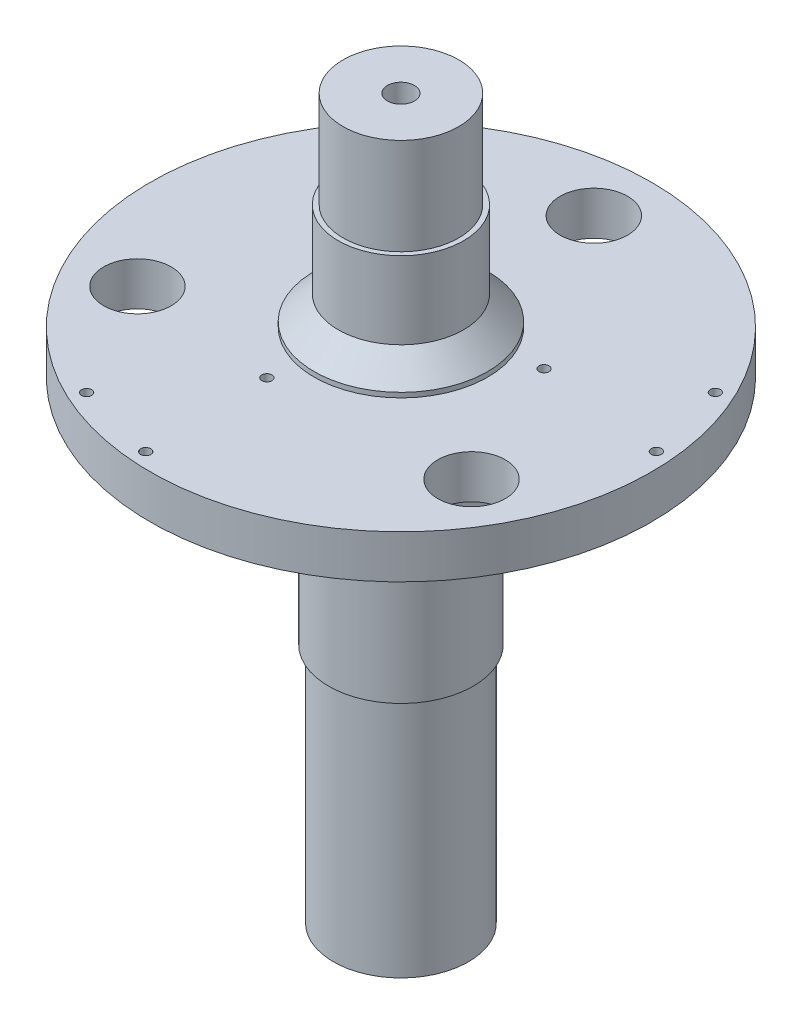
ISO-10303-21;
HEADER;
FILE_DESCRIPTION(('STEP AP214'),'2;1');
FILE_NAME('part.step','',(''),(''),'','','');
FILE_SCHEMA(('AUTOMOTIVE_DESIGN { 1 0 10303 214 1 1 1 1 }'));
ENDSEC;
DATA;
#1=APPLICATION_CONTEXT('core data for automotive mechanical design processes');
#2=APPLICATION_PROTOCOL_DEFINITION('international standard','automotive_design',2000,#1);
#3=PRODUCT_CONTEXT('',#1,'mechanical');
#4=PRODUCT('Part','Part','',(#3));
#5=PRODUCT_RELATED_PRODUCT_CATEGORY('part','',(#4));
#6=PRODUCT_DEFINITION_FORMATION('','',#4);
#7=PRODUCT_DEFINITION_CONTEXT('part definition',#1,'design');
#8=PRODUCT_DEFINITION('design','',#6,#7);
#9=PRODUCT_DEFINITION_SHAPE('','',#8);
#10=(LENGTH_UNIT() NAMED_UNIT(*) SI_UNIT(.MILLI.,.METRE.));
#11=(NAMED_UNIT(*) PLANE_ANGLE_UNIT() SI_UNIT($,.RADIAN.));
#12=(NAMED_UNIT(*) SI_UNIT($,.STERADIAN.) SOLID_ANGLE_UNIT());
#13=UNCERTAINTY_MEASURE_WITH_UNIT(LENGTH_MEASURE(1.E-05),#10,'distance_accuracy_value','');
#14=(GEOMETRIC_REPRESENTATION_CONTEXT(3) GLOBAL_UNCERTAINTY_ASSIGNED_CONTEXT((#13)) GLOBAL_UNIT_ASSIGNED_CONTEXT((#10,
#11,#12)) REPRESENTATION_CONTEXT('',''));
#15=CARTESIAN_POINT('',(0.,0.,0.));
#16=DIRECTION('',(0.,0.,1.));
#17=DIRECTION('',(1.,0.,0.));
#18=AXIS2_PLACEMENT_3D('',#15,#16,#17);
#19=CARTESIAN_POINT('',(0.,0.,0.));
#20=DIRECTION('',(0.,-1.,0.));
#21=DIRECTION('',(0.,0.,-1.));
#22=AXIS2_PLACEMENT_3D('',#19,#20,#21);
#23=PLANE('',#22);
#24=CARTESIAN_POINT('',(0.,0.,0.));
#25=DIRECTION('',(0.,1.,0.));
#26=DIRECTION('',(0.,0.,1.));
#27=AXIS2_PLACEMENT_3D('',#24,#25,#26);
#28=CIRCLE('',#27,14.);
#29=CARTESIAN_POINT('',(0.,0.,14.));
#30=VERTEX_POINT('',#29);
#31=EDGE_CURVE('E63',#30,#30,#28,.T.);
#32=ORIENTED_EDGE('',*,*,#31,.F.);
#33=EDGE_LOOP('',(#32));
#34=FACE_BOUND('',#33,.T.);
#35=CARTESIAN_POINT('',(0.,0.,0.));
#36=DIRECTION('',(0.,-1.,0.));
#37=DIRECTION('',(0.,0.,-1.));
#38=AXIS2_PLACEMENT_3D('',#35,#36,#37);
#39=CIRCLE('',#38,60.);
#40=CARTESIAN_POINT('',(0.,0.,-60.));
#41=VERTEX_POINT('',#40);
#42=EDGE_CURVE('E11',#41,#41,#39,.T.);
#43=ORIENTED_EDGE('',*,*,#42,.F.);
#44=EDGE_LOOP('',(#43));
#45=FACE_BOUND('',#44,.T.);
#46=ADVANCED_FACE('F43',(#34,#45),#23,.F.);
#47=CARTESIAN_POINT('',(0.,-745.,0.));
#48=DIRECTION('',(0.,-1.,0.));
#49=DIRECTION('',(0.,0.,-1.));
#50=AXIS2_PLACEMENT_3D('',#47,#48,#49);
#51=CYLINDRICAL_SURFACE('',#50,60.);
#52=CARTESIAN_POINT('',(0.,-100.,0.));
#53=DIRECTION('',(0.,-1.,0.));
#54=DIRECTION('',(0.,0.,-1.));
#55=AXIS2_PLACEMENT_3D('',#52,#53,#54);
#56=CIRCLE('',#55,60.);
#57=CARTESIAN_POINT('',(0.,-100.,-60.));
#58=VERTEX_POINT('',#57);
#59=EDGE_CURVE('E49',#58,#58,#56,.T.);
#60=ORIENTED_EDGE('',*,*,#59,.F.);
#61=EDGE_LOOP('',(#60));
#62=FACE_BOUND('',#61,.T.);
#63=ORIENTED_EDGE('',*,*,#42,.T.);
#64=EDGE_LOOP('',(#63));
#65=FACE_BOUND('',#64,.T.);
#66=ADVANCED_FACE('F103',(#62,#65),#51,.T.);
#67=CARTESIAN_POINT('',(-60.,-100.,0.));
#68=DIRECTION('',(0.,-1.,0.));
#69=DIRECTION('',(0.,0.,-1.));
#70=AXIS2_PLACEMENT_3D('',#67,#68,#69);
#71=PLANE('',#70);
#72=CARTESIAN_POINT('',(0.,-100.,0.));
#73=DIRECTION('',(0.,-1.,0.));
#74=DIRECTION('',(0.,0.,-1.));
#75=AXIS2_PLACEMENT_3D('',#72,#73,#74);
#76=CIRCLE('',#75,65.);
#77=CARTESIAN_POINT('',(0.,-100.,-65.));
#78=VERTEX_POINT('',#77);
#79=EDGE_CURVE('E96',#78,#78,#76,.T.);
#80=ORIENTED_EDGE('',*,*,#79,.F.);
#81=EDGE_LOOP('',(#80));
#82=FACE_BOUND('',#81,.T.);
#83=ORIENTED_EDGE('',*,*,#59,.T.);
#84=EDGE_LOOP('',(#83));
#85=FACE_BOUND('',#84,.T.);
#86=ADVANCED_FACE('F101',(#82,#85),#71,.F.);
#87=CARTESIAN_POINT('',(0.,-745.,0.));
#88=DIRECTION('',(0.,-1.,0.));
#89=DIRECTION('',(0.,0.,-1.));
#90=AXIS2_PLACEMENT_3D('',#87,#88,#89);
#91=CYLINDRICAL_SURFACE('',#90,65.0000000000001);
#92=CARTESIAN_POINT('',(0.,-180.,0.));
#93=DIRECTION('',(0.,-1.,0.));
#94=DIRECTION('',(0.,0.,-1.));
#95=AXIS2_PLACEMENT_3D('',#92,#93,#94);
#96=CIRCLE('',#95,65.0000000000001);
#97=CARTESIAN_POINT('',(0.,-180.,-65.0000000000001));
#98=VERTEX_POINT('',#97);
#99=EDGE_CURVE('E93',#98,#98,#96,.T.);
#100=ORIENTED_EDGE('',*,*,#99,.F.);
#101=EDGE_LOOP('',(#100));
#102=FACE_BOUND('',#101,.T.);
#103=ORIENTED_EDGE('',*,*,#79,.T.);
#104=EDGE_LOOP('',(#103));
#105=FACE_BOUND('',#104,.T.);
#106=ADVANCED_FACE('F161',(#102,#105),#91,.T.);
#107=CARTESIAN_POINT('',(0.,-180.,0.));
#108=DIRECTION('',(0.,-1.,0.));
#109=DIRECTION('',(0.,0.,-1.));
#110=AXIS2_PLACEMENT_3D('',#107,#108,#109);
#111=CONICAL_SURFACE('',#110,65.0000000000001,0.78539816339745);
#112=CARTESIAN_POINT('',(0.,-205.,0.));
#113=DIRECTION('',(0.,-1.,0.));
#114=DIRECTION('',(0.,0.,-1.));
#115=AXIS2_PLACEMENT_3D('',#112,#113,#114);
#116=CIRCLE('',#115,90.);
#117=CARTESIAN_POINT('',(0.,-205.,-90.));
#118=VERTEX_POINT('',#117);
#119=EDGE_CURVE('E90',#118,#118,#116,.T.);
#120=ORIENTED_EDGE('',*,*,#119,.F.);
#121=EDGE_LOOP('',(#120));
#122=FACE_BOUND('',#121,.T.);
#123=ORIENTED_EDGE('',*,*,#99,.T.);
#124=EDGE_LOOP('',(#123));
#125=FACE_BOUND('',#124,.T.);
#126=ADVANCED_FACE('F157',(#122,#125),#111,.T.);
#127=CARTESIAN_POINT('',(0.,-745.,0.));
#128=DIRECTION('',(0.,-1.,0.));
#129=DIRECTION('',(0.,0.,-1.));
#130=AXIS2_PLACEMENT_3D('',#127,#128,#129);
#131=CYLINDRICAL_SURFACE('',#130,90.);
#132=CARTESIAN_POINT('',(0.,-210.,0.));
#133=DIRECTION('',(0.,-1.,0.));
#134=DIRECTION('',(0.,0.,-1.));
#135=AXIS2_PLACEMENT_3D('',#132,#133,#134);
#136=CIRCLE('',#135,90.);
#137=CARTESIAN_POINT('',(0.,-210.,-90.));
#138=VERTEX_POINT('',#137);
#139=EDGE_CURVE('E87',#138,#138,#136,.T.);
#140=ORIENTED_EDGE('',*,*,#139,.F.);
#141=EDGE_LOOP('',(#140));
#142=FACE_BOUND('',#141,.T.);
#143=ORIENTED_EDGE('',*,*,#119,.T.);
#144=EDGE_LOOP('',(#143));
#145=FACE_BOUND('',#144,.T.);
#146=ADVANCED_FACE('F153',(#142,#145),#131,.T.);
#147=CARTESIAN_POINT('',(-90.,-210.,0.));
#148=DIRECTION('',(0.,-1.,0.));
#149=DIRECTION('',(0.,0.,-1.));
#150=AXIS2_PLACEMENT_3D('',#147,#148,#149);
#151=PLANE('',#150);
#152=CARTESIAN_POINT('',(-140.014777196767,-210.,-201.049402303364));
#153=DIRECTION('',(0.,1.,0.));
#154=DIRECTION('',(-0.866025403784436,0.,-0.500000000000004));
#155=AXIS2_PLACEMENT_3D('',#152,#153,#154);
#156=CIRCLE('',#155,5.25);
#157=CARTESIAN_POINT('',(-144.561410566635,-210.,-203.674402303364));
#158=VERTEX_POINT('',#157);
#159=EDGE_CURVE('E439',#158,#158,#156,.T.);
#160=ORIENTED_EDGE('',*,*,#159,.F.);
#161=EDGE_LOOP('',(#160));
#162=FACE_BOUND('',#161,.T.);
#163=CARTESIAN_POINT('',(-201.202562281703,-210.,-139.794595500961));
#164=DIRECTION('',(0.,1.,0.));
#165=DIRECTION('',(-0.866025403784436,0.,-0.500000000000004));
#166=AXIS2_PLACEMENT_3D('',#163,#164,#165);
#167=CIRCLE('',#166,5.25);
#168=CARTESIAN_POINT('',(-205.749195651571,-210.,-142.419595500961));
#169=VERTEX_POINT('',#168);
#170=EDGE_CURVE('E453',#169,#169,#167,.T.);
#171=ORIENTED_EDGE('',*,*,#170,.F.);
#172=EDGE_LOOP('',(#171));
#173=FACE_BOUND('',#172,.T.);
#174=CARTESIAN_POINT('',(111.599940600251,-210.,-36.7655172413023));
#175=DIRECTION('',(0.,1.,0.));
#176=DIRECTION('',(0.866025403784443,0.,-0.499999999999992));
#177=AXIS2_PLACEMENT_3D('',#174,#175,#176);
#178=CIRCLE('',#177,5.25);
#179=CARTESIAN_POINT('',(116.146573970119,-210.,-39.3905172413023));
#180=VERTEX_POINT('',#179);
#181=EDGE_CURVE('E459',#180,#180,#178,.T.);
#182=ORIENTED_EDGE('',*,*,#181,.F.);
#183=EDGE_LOOP('',(#182));
#184=FACE_BOUND('',#183,.T.);
#185=CARTESIAN_POINT('',(244.121278408774,-210.,-20.731652805935));
#186=DIRECTION('',(0.,1.,0.));
#187=DIRECTION('',(0.866025403784443,0.,-0.499999999999992));
#188=AXIS2_PLACEMENT_3D('',#185,#186,#187);
#189=CIRCLE('',#188,5.25);
#190=CARTESIAN_POINT('',(248.667911778642,-210.,-23.356652805935));
#191=VERTEX_POINT('',#190);
#192=EDGE_CURVE('E465',#191,#191,#189,.T.);
#193=ORIENTED_EDGE('',*,*,#192,.F.);
#194=EDGE_LOOP('',(#193));
#195=FACE_BOUND('',#194,.T.);
#196=CARTESIAN_POINT('',(221.666952156454,-210.,-104.349232491994));
#197=DIRECTION('',(0.,1.,0.));
#198=DIRECTION('',(0.866025403784443,0.,-0.499999999999992));
#199=AXIS2_PLACEMENT_3D('',#196,#197,#198);
#200=CIRCLE('',#199,5.25);
#201=CARTESIAN_POINT('',(226.213585526323,-210.,-106.974232491994));
#202=VERTEX_POINT('',#201);
#203=EDGE_CURVE('E448',#202,#202,#200,.T.);
#204=ORIENTED_EDGE('',*,*,#203,.F.);
#205=EDGE_LOOP('',(#204));
#206=FACE_BOUND('',#205,.T.);
#207=CARTESIAN_POINT('',(-87.6398422143684,-210.,-78.265625));
#208=DIRECTION('',(0.,1.,0.));
#209=DIRECTION('',(-0.866025403784436,0.,-0.500000000000004));
#210=AXIS2_PLACEMENT_3D('',#207,#208,#209);
#211=CIRCLE('',#210,5.25);
#212=CARTESIAN_POINT('',(-92.1864755842366,-210.,-80.890625));
#213=VERTEX_POINT('',#212);
#214=EDGE_CURVE('E438',#213,#213,#211,.T.);
#215=ORIENTED_EDGE('',*,*,#214,.F.);
#216=EDGE_LOOP('',(#215));
#217=FACE_BOUND('',#216,.T.);
#218=CARTESIAN_POINT('',(-23.9600983858817,-210.,115.031142241303));
#219=DIRECTION('',(0.,1.,0.));
#220=DIRECTION('',(0.,0.,1.));
#221=AXIS2_PLACEMENT_3D('',#218,#219,#220);
#222=CIRCLE('',#221,5.25);
#223=CARTESIAN_POINT('',(-23.9600983858817,-210.,120.281142241303));
#224=VERTEX_POINT('',#223);
#225=EDGE_CURVE('E476',#224,#224,#222,.T.);
#226=ORIENTED_EDGE('',*,*,#225,.F.);
#227=EDGE_LOOP('',(#226));
#228=FACE_BOUND('',#227,.T.);
#229=CARTESIAN_POINT('',(-104.106501212006,-210.,221.7810551093));
#230=DIRECTION('',(0.,1.,0.));
#231=DIRECTION('',(0.,0.,1.));
#232=AXIS2_PLACEMENT_3D('',#229,#230,#231);
#233=CIRCLE('',#232,5.25);
#234=CARTESIAN_POINT('',(-104.106501212006,-210.,227.0310551093));
#235=VERTEX_POINT('',#234);
#236=EDGE_CURVE('E482',#235,#235,#233,.T.);
#237=ORIENTED_EDGE('',*,*,#236,.F.);
#238=EDGE_LOOP('',(#237));
#239=FACE_BOUND('',#238,.T.);
#240=CARTESIAN_POINT('',(-20.4643898747497,-210.,244.143827992956));
#241=DIRECTION('',(0.,1.,0.));
#242=DIRECTION('',(0.,0.,1.));
#243=AXIS2_PLACEMENT_3D('',#240,#241,#242);
#244=CIRCLE('',#243,5.25);
#245=CARTESIAN_POINT('',(-20.4643898747497,-210.,249.393827992956));
#246=VERTEX_POINT('',#245);
#247=EDGE_CURVE('E470',#246,#246,#244,.T.);
#248=ORIENTED_EDGE('',*,*,#247,.F.);
#249=EDGE_LOOP('',(#248));
#250=FACE_BOUND('',#249,.T.);
#251=CARTESIAN_POINT('',(0.,-210.,-200.));
#252=DIRECTION('',(0.,1.,0.));
#253=DIRECTION('',(-0.866025403784436,0.,-0.500000000000004));
#254=AXIS2_PLACEMENT_3D('',#251,#252,#253);
#255=CIRCLE('',#254,35.);
#256=CARTESIAN_POINT('',(-30.3108891324554,-210.,-217.5));
#257=VERTEX_POINT('',#256);
#258=EDGE_CURVE('E490',#257,#257,#255,.T.);
#259=ORIENTED_EDGE('',*,*,#258,.F.);
#260=EDGE_LOOP('',(#259));
#261=FACE_BOUND('',#260,.T.);
#262=CARTESIAN_POINT('',(173.205080756887,-210.,100.000000000001));
#263=DIRECTION('',(0.,1.,0.));
#264=DIRECTION('',(0.866025403784443,0.,-0.499999999999992));
#265=AXIS2_PLACEMENT_3D('',#262,#263,#264);
#266=CIRCLE('',#265,35.);
#267=CARTESIAN_POINT('',(203.515969889343,-210.,82.500000000001));
#268=VERTEX_POINT('',#267);
#269=EDGE_CURVE('E475',#268,#268,#266,.T.);
#270=ORIENTED_EDGE('',*,*,#269,.F.);
#271=EDGE_LOOP('',(#270));
#272=FACE_BOUND('',#271,.T.);
#273=CARTESIAN_POINT('',(-173.205080756887,-210.,100.000000000001));
#274=DIRECTION('',(0.,1.,0.));
#275=DIRECTION('',(0.,0.,1.));
#276=AXIS2_PLACEMENT_3D('',#273,#274,#275);
#277=CIRCLE('',#276,35.);
#278=CARTESIAN_POINT('',(-173.205080756887,-210.,135.000000000001));
#279=VERTEX_POINT('',#278);
#280=EDGE_CURVE('E497',#279,#279,#277,.T.);
#281=ORIENTED_EDGE('',*,*,#280,.F.);
#282=EDGE_LOOP('',(#281));
#283=FACE_BOUND('',#282,.T.);
#284=CARTESIAN_POINT('',(0.,-210.,0.));
#285=DIRECTION('',(0.,-1.,0.));
#286=DIRECTION('',(0.,0.,-1.));
#287=AXIS2_PLACEMENT_3D('',#284,#285,#286);
#288=CIRCLE('',#287,260.);
#289=CARTESIAN_POINT('',(0.,-210.,-260.));
#290=VERTEX_POINT('',#289);
#291=EDGE_CURVE('E84',#290,#290,#288,.T.);
#292=ORIENTED_EDGE('',*,*,#291,.F.);
#293=EDGE_LOOP('',(#292));
#294=FACE_BOUND('',#293,.T.);
#295=ORIENTED_EDGE('',*,*,#139,.T.);
#296=EDGE_LOOP('',(#295));
#297=FACE_BOUND('',#296,.T.);
#298=ADVANCED_FACE('F149',(#162,#173,#184,#195,#206,#217,#228,#239,#250,#261,#272,#283,#294,
#297),#151,.F.);
#299=CARTESIAN_POINT('',(0.,-745.,0.));
#300=DIRECTION('',(0.,-1.,0.));
#301=DIRECTION('',(0.,0.,-1.));
#302=AXIS2_PLACEMENT_3D('',#299,#300,#301);
#303=CYLINDRICAL_SURFACE('',#302,260.);
#304=CARTESIAN_POINT('',(0.,-255.,0.));
#305=DIRECTION('',(0.,-1.,0.));
#306=DIRECTION('',(0.,0.,-1.));
#307=AXIS2_PLACEMENT_3D('',#304,#305,#306);
#308=CIRCLE('',#307,260.);
#309=CARTESIAN_POINT('',(0.,-255.,-260.));
#310=VERTEX_POINT('',#309);
#311=EDGE_CURVE('E81',#310,#310,#308,.T.);
#312=ORIENTED_EDGE('',*,*,#311,.F.);
#313=EDGE_LOOP('',(#312));
#314=FACE_BOUND('',#313,.T.);
#315=ORIENTED_EDGE('',*,*,#291,.T.);
#316=EDGE_LOOP('',(#315));
#317=FACE_BOUND('',#316,.T.);
#318=ADVANCED_FACE('F145',(#314,#317),#303,.T.);
#319=CARTESIAN_POINT('',(-260.,-255.,0.));
#320=DIRECTION('',(0.,1.,0.));
#321=DIRECTION('',(0.,0.,1.));
#322=AXIS2_PLACEMENT_3D('',#319,#320,#321);
#323=PLANE('',#322);
#324=CARTESIAN_POINT('',(0.,-255.,-200.));
#325=DIRECTION('',(0.,1.,0.));
#326=DIRECTION('',(0.,0.,1.));
#327=AXIS2_PLACEMENT_3D('',#324,#325,#326);
#328=CIRCLE('',#327,35.);
#329=CARTESIAN_POINT('',(0.,-255.,-165.));
#330=VERTEX_POINT('',#329);
#331=EDGE_CURVE('E493',#330,#330,#328,.F.);
#332=ORIENTED_EDGE('',*,*,#331,.F.);
#333=EDGE_LOOP('',(#332));
#334=FACE_BOUND('',#333,.T.);
#335=CARTESIAN_POINT('',(173.205080756887,-255.,100.000000000001));
#336=DIRECTION('',(0.,1.,0.));
#337=DIRECTION('',(0.,0.,1.));
#338=AXIS2_PLACEMENT_3D('',#335,#336,#337);
#339=CIRCLE('',#338,35.);
#340=CARTESIAN_POINT('',(173.205080756887,-255.,135.000000000001));
#341=VERTEX_POINT('',#340);
#342=EDGE_CURVE('E494',#341,#341,#339,.F.);
#343=ORIENTED_EDGE('',*,*,#342,.F.);
#344=EDGE_LOOP('',(#343));
#345=FACE_BOUND('',#344,.T.);
#346=CARTESIAN_POINT('',(-173.205080756887,-255.,100.000000000001));
#347=DIRECTION('',(0.,1.,0.));
#348=DIRECTION('',(0.,0.,1.));
#349=AXIS2_PLACEMENT_3D('',#346,#347,#348);
#350=CIRCLE('',#349,35.);
#351=CARTESIAN_POINT('',(-173.205080756887,-255.,135.000000000001));
#352=VERTEX_POINT('',#351);
#353=EDGE_CURVE('E69',#352,#352,#350,.F.);
#354=ORIENTED_EDGE('',*,*,#353,.F.);
#355=EDGE_LOOP('',(#354));
#356=FACE_BOUND('',#355,.T.);
#357=CARTESIAN_POINT('',(0.,-255.,0.));
#358=DIRECTION('',(0.,-1.,0.));
#359=DIRECTION('',(0.,0.,-1.));
#360=AXIS2_PLACEMENT_3D('',#357,#358,#359);
#361=CIRCLE('',#360,75.);
#362=CARTESIAN_POINT('',(0.,-255.,-75.));
#363=VERTEX_POINT('',#362);
#364=EDGE_CURVE('E78',#363,#363,#361,.T.);
#365=ORIENTED_EDGE('',*,*,#364,.F.);
#366=EDGE_LOOP('',(#365));
#367=FACE_BOUND('',#366,.T.);
#368=ORIENTED_EDGE('',*,*,#311,.T.);
#369=EDGE_LOOP('',(#368));
#370=FACE_BOUND('',#369,.T.);
#371=ADVANCED_FACE('F141',(#334,#345,#356,#367,#370),#323,.F.);
#372=CARTESIAN_POINT('',(0.,-745.,0.));
#373=DIRECTION('',(0.,-1.,0.));
#374=DIRECTION('',(0.,0.,-1.));
#375=AXIS2_PLACEMENT_3D('',#372,#373,#374);
#376=CYLINDRICAL_SURFACE('',#375,75.);
#377=CARTESIAN_POINT('',(0.,-495.,0.));
#378=DIRECTION('',(0.,-1.,0.));
#379=DIRECTION('',(0.,0.,-1.));
#380=AXIS2_PLACEMENT_3D('',#377,#378,#379);
#381=CIRCLE('',#380,75.);
#382=CARTESIAN_POINT('',(0.,-495.,-75.));
#383=VERTEX_POINT('',#382);
#384=EDGE_CURVE('E75',#383,#383,#381,.T.);
#385=ORIENTED_EDGE('',*,*,#384,.F.);
#386=EDGE_LOOP('',(#385));
#387=FACE_BOUND('',#386,.T.);
#388=ORIENTED_EDGE('',*,*,#364,.T.);
#389=EDGE_LOOP('',(#388));
#390=FACE_BOUND('',#389,.T.);
#391=ADVANCED_FACE('F137',(#387,#390),#376,.T.);
#392=CARTESIAN_POINT('',(-75.,-495.,0.));
#393=DIRECTION('',(0.,1.,0.));
#394=DIRECTION('',(0.,0.,1.));
#395=AXIS2_PLACEMENT_3D('',#392,#393,#394);
#396=PLANE('',#395);
#397=CARTESIAN_POINT('',(0.,-495.,0.));
#398=DIRECTION('',(0.,-1.,0.));
#399=DIRECTION('',(0.,0.,-1.));
#400=AXIS2_PLACEMENT_3D('',#397,#398,#399);
#401=CIRCLE('',#400,70.);
#402=CARTESIAN_POINT('',(0.,-495.,-70.));
#403=VERTEX_POINT('',#402);
#404=EDGE_CURVE('E66',#403,#403,#401,.T.);
#405=ORIENTED_EDGE('',*,*,#404,.F.);
#406=EDGE_LOOP('',(#405));
#407=FACE_BOUND('',#406,.T.);
#408=ORIENTED_EDGE('',*,*,#384,.T.);
#409=EDGE_LOOP('',(#408));
#410=FACE_BOUND('',#409,.T.);
#411=ADVANCED_FACE('F133',(#407,#410),#396,.F.);
#412=CARTESIAN_POINT('',(0.,-745.,0.));
#413=DIRECTION('',(0.,-1.,0.));
#414=DIRECTION('',(0.,0.,-1.));
#415=AXIS2_PLACEMENT_3D('',#412,#413,#414);
#416=CYLINDRICAL_SURFACE('',#415,70.);
#417=CARTESIAN_POINT('',(0.,-745.,0.));
#418=DIRECTION('',(0.,-1.,0.));
#419=DIRECTION('',(0.,0.,-1.));
#420=AXIS2_PLACEMENT_3D('',#417,#418,#419);
#421=CIRCLE('',#420,70.);
#422=CARTESIAN_POINT('',(0.,-745.,-70.));
#423=VERTEX_POINT('',#422);
#424=EDGE_CURVE('E62',#423,#423,#421,.T.);
#425=ORIENTED_EDGE('',*,*,#424,.F.);
#426=EDGE_LOOP('',(#425));
#427=FACE_BOUND('',#426,.T.);
#428=ORIENTED_EDGE('',*,*,#404,.T.);
#429=EDGE_LOOP('',(#428));
#430=FACE_BOUND('',#429,.T.);
#431=ADVANCED_FACE('F129',(#427,#430),#416,.T.);
#432=CARTESIAN_POINT('',(-70.,-745.,0.));
#433=DIRECTION('',(0.,1.,0.));
#434=DIRECTION('',(0.,0.,1.));
#435=AXIS2_PLACEMENT_3D('',#432,#433,#434);
#436=PLANE('',#435);
#437=ORIENTED_EDGE('',*,*,#424,.T.);
#438=EDGE_LOOP('',(#437));
#439=FACE_BOUND('',#438,.T.);
#440=ADVANCED_FACE('F56',(#439),#436,.F.);
#441=CARTESIAN_POINT('',(0.,-60.,0.));
#442=DIRECTION('',(0.,1.,0.));
#443=DIRECTION('',(0.,0.,1.));
#444=AXIS2_PLACEMENT_3D('',#441,#442,#443);
#445=CONICAL_SURFACE('',#444,14.,1.02974425867665);
#446=CARTESIAN_POINT('',(0.,-68.4120486663859,0.));
#447=VERTEX_POINT('',#446);
#448=VERTEX_LOOP('',#447);
#449=FACE_BOUND('',#448,.T.);
#450=CARTESIAN_POINT('',(0.,-60.,0.));
#451=DIRECTION('',(0.,1.,0.));
#452=DIRECTION('',(0.,0.,1.));
#453=AXIS2_PLACEMENT_3D('',#450,#451,#452);
#454=CIRCLE('',#453,14.);
#455=CARTESIAN_POINT('',(0.,-60.,14.));
#456=VERTEX_POINT('',#455);
#457=EDGE_CURVE('E60',#456,#456,#454,.T.);
#458=ORIENTED_EDGE('',*,*,#457,.T.);
#459=EDGE_LOOP('',(#458));
#460=FACE_BOUND('',#459,.T.);
#461=ADVANCED_FACE('F52',(#449,#460),#445,.F.);
#462=CARTESIAN_POINT('',(0.,0.,0.));
#463=DIRECTION('',(0.,1.,0.));
#464=DIRECTION('',(0.,0.,1.));
#465=AXIS2_PLACEMENT_3D('',#462,#463,#464);
#466=CYLINDRICAL_SURFACE('',#465,14.);
#467=ORIENTED_EDGE('',*,*,#457,.F.);
#468=EDGE_LOOP('',(#467));
#469=FACE_BOUND('',#468,.T.);
#470=ORIENTED_EDGE('',*,*,#31,.T.);
#471=EDGE_LOOP('',(#470));
#472=FACE_BOUND('',#471,.T.);
#473=ADVANCED_FACE('F55',(#469,#472),#466,.F.);
#474=CARTESIAN_POINT('',(-173.205080756887,-745.001,100.000000000001));
#475=DIRECTION('',(0.,1.,0.));
#476=DIRECTION('',(0.,0.,1.));
#477=AXIS2_PLACEMENT_3D('',#474,#475,#476);
#478=CYLINDRICAL_SURFACE('',#477,35.);
#479=ORIENTED_EDGE('',*,*,#280,.T.);
#480=EDGE_LOOP('',(#479));
#481=FACE_BOUND('',#480,.T.);
#482=ORIENTED_EDGE('',*,*,#353,.T.);
#483=EDGE_LOOP('',(#482));
#484=FACE_BOUND('',#483,.T.);
#485=ADVANCED_FACE('F117',(#481,#484),#478,.F.);
#486=CARTESIAN_POINT('',(173.205080756887,-745.001,100.000000000001));
#487=DIRECTION('',(0.,1.,0.));
#488=DIRECTION('',(0.,0.,1.));
#489=AXIS2_PLACEMENT_3D('',#486,#487,#488);
#490=CYLINDRICAL_SURFACE('',#489,35.);
#491=ORIENTED_EDGE('',*,*,#269,.T.);
#492=EDGE_LOOP('',(#491));
#493=FACE_BOUND('',#492,.T.);
#494=ORIENTED_EDGE('',*,*,#342,.T.);
#495=EDGE_LOOP('',(#494));
#496=FACE_BOUND('',#495,.T.);
#497=ADVANCED_FACE('F122',(#493,#496),#490,.F.);
#498=CARTESIAN_POINT('',(0.,-745.001,-200.));
#499=DIRECTION('',(0.,1.,0.));
#500=DIRECTION('',(0.,0.,1.));
#501=AXIS2_PLACEMENT_3D('',#498,#499,#500);
#502=CYLINDRICAL_SURFACE('',#501,35.);
#503=ORIENTED_EDGE('',*,*,#258,.T.);
#504=EDGE_LOOP('',(#503));
#505=FACE_BOUND('',#504,.T.);
#506=ORIENTED_EDGE('',*,*,#331,.T.);
#507=EDGE_LOOP('',(#506));
#508=FACE_BOUND('',#507,.T.);
#509=ADVANCED_FACE('F244',(#505,#508),#502,.F.);
#510=CARTESIAN_POINT('',(-20.4643898747497,-240.,244.143827992956));
#511=DIRECTION('',(0.,1.,0.));
#512=DIRECTION('',(0.,0.,1.));
#513=AXIS2_PLACEMENT_3D('',#510,#511,#512);
#514=CYLINDRICAL_SURFACE('',#513,5.25);
#515=CARTESIAN_POINT('',(-20.4643898747497,-240.,244.143827992956));
#516=DIRECTION('',(0.,1.,0.));
#517=DIRECTION('',(0.,0.,1.));
#518=AXIS2_PLACEMENT_3D('',#515,#516,#517);
#519=CIRCLE('',#518,5.25);
#520=CARTESIAN_POINT('',(-20.4643898747497,-240.,249.393827992956));
#521=VERTEX_POINT('',#520);
#522=EDGE_CURVE('E485',#521,#521,#519,.T.);
#523=ORIENTED_EDGE('',*,*,#522,.F.);
#524=EDGE_LOOP('',(#523));
#525=FACE_BOUND('',#524,.T.);
#526=ORIENTED_EDGE('',*,*,#247,.T.);
#527=EDGE_LOOP('',(#526));
#528=FACE_BOUND('',#527,.T.);
#529=ADVANCED_FACE('F250',(#525,#528),#514,.F.);
#530=CARTESIAN_POINT('',(-20.4643898747497,-240.,244.143827992956));
#531=DIRECTION('',(0.,1.,0.));
#532=DIRECTION('',(0.,0.,1.));
#533=AXIS2_PLACEMENT_3D('',#530,#531,#532);
#534=PLANE('',#533);
#535=ORIENTED_EDGE('',*,*,#522,.T.);
#536=EDGE_LOOP('',(#535));
#537=FACE_BOUND('',#536,.T.);
#538=ADVANCED_FACE('F258',(#537),#534,.T.);
#539=CARTESIAN_POINT('',(-104.106501212006,-240.,221.7810551093));
#540=DIRECTION('',(0.,1.,0.));
#541=DIRECTION('',(0.,0.,1.));
#542=AXIS2_PLACEMENT_3D('',#539,#540,#541);
#543=CYLINDRICAL_SURFACE('',#542,5.25);
#544=CARTESIAN_POINT('',(-104.106501212006,-240.,221.7810551093));
#545=DIRECTION('',(0.,1.,0.));
#546=DIRECTION('',(0.,0.,1.));
#547=AXIS2_PLACEMENT_3D('',#544,#545,#546);
#548=CIRCLE('',#547,5.25);
#549=CARTESIAN_POINT('',(-104.106501212006,-240.,227.0310551093));
#550=VERTEX_POINT('',#549);
#551=EDGE_CURVE('E479',#550,#550,#548,.T.);
#552=ORIENTED_EDGE('',*,*,#551,.F.);
#553=EDGE_LOOP('',(#552));
#554=FACE_BOUND('',#553,.T.);
#555=ORIENTED_EDGE('',*,*,#236,.T.);
#556=EDGE_LOOP('',(#555));
#557=FACE_BOUND('',#556,.T.);
#558=ADVANCED_FACE('F266',(#554,#557),#543,.F.);
#559=CARTESIAN_POINT('',(-104.106501212006,-240.,221.7810551093));
#560=DIRECTION('',(0.,1.,0.));
#561=DIRECTION('',(0.,0.,1.));
#562=AXIS2_PLACEMENT_3D('',#559,#560,#561);
#563=PLANE('',#562);
#564=ORIENTED_EDGE('',*,*,#551,.T.);
#565=EDGE_LOOP('',(#564));
#566=FACE_BOUND('',#565,.T.);
#567=ADVANCED_FACE('F274',(#566),#563,.T.);
#568=CARTESIAN_POINT('',(-23.9600983858817,-240.,115.031142241303));
#569=DIRECTION('',(0.,1.,0.));
#570=DIRECTION('',(0.,0.,1.));
#571=AXIS2_PLACEMENT_3D('',#568,#569,#570);
#572=CYLINDRICAL_SURFACE('',#571,5.25);
#573=CARTESIAN_POINT('',(-23.9600983858817,-240.,115.031142241303));
#574=DIRECTION('',(0.,1.,0.));
#575=DIRECTION('',(0.,0.,1.));
#576=AXIS2_PLACEMENT_3D('',#573,#574,#575);
#577=CIRCLE('',#576,5.25);
#578=CARTESIAN_POINT('',(-23.9600983858817,-240.,120.281142241303));
#579=VERTEX_POINT('',#578);
#580=EDGE_CURVE('E472',#579,#579,#577,.T.);
#581=ORIENTED_EDGE('',*,*,#580,.F.);
#582=EDGE_LOOP('',(#581));
#583=FACE_BOUND('',#582,.T.);
#584=ORIENTED_EDGE('',*,*,#225,.T.);
#585=EDGE_LOOP('',(#584));
#586=FACE_BOUND('',#585,.T.);
#587=ADVANCED_FACE('F282',(#583,#586),#572,.F.);
#588=CARTESIAN_POINT('',(-23.9600983858817,-240.,115.031142241303));
#589=DIRECTION('',(0.,1.,0.));
#590=DIRECTION('',(0.,0.,1.));
#591=AXIS2_PLACEMENT_3D('',#588,#589,#590);
#592=PLANE('',#591);
#593=ORIENTED_EDGE('',*,*,#580,.T.);
#594=EDGE_LOOP('',(#593));
#595=FACE_BOUND('',#594,.T.);
#596=ADVANCED_FACE('F290',(#595),#592,.T.);
#597=CARTESIAN_POINT('',(-87.6398422143684,-240.,-78.265625));
#598=DIRECTION('',(0.,1.,0.));
#599=DIRECTION('',(0.,0.,1.));
#600=AXIS2_PLACEMENT_3D('',#597,#598,#599);
#601=CYLINDRICAL_SURFACE('',#600,5.25);
#602=CARTESIAN_POINT('',(-87.6398422143684,-240.,-78.265625));
#603=DIRECTION('',(0.,1.,0.));
#604=DIRECTION('',(-0.866025403784436,0.,-0.500000000000004));
#605=AXIS2_PLACEMENT_3D('',#602,#603,#604);
#606=CIRCLE('',#605,5.25);
#607=CARTESIAN_POINT('',(-92.1864755842366,-240.,-80.890625));
#608=VERTEX_POINT('',#607);
#609=EDGE_CURVE('E442',#608,#608,#606,.T.);
#610=ORIENTED_EDGE('',*,*,#609,.F.);
#611=EDGE_LOOP('',(#610));
#612=FACE_BOUND('',#611,.T.);
#613=ORIENTED_EDGE('',*,*,#214,.T.);
#614=EDGE_LOOP('',(#613));
#615=FACE_BOUND('',#614,.T.);
#616=ADVANCED_FACE('F297',(#612,#615),#601,.F.);
#617=CARTESIAN_POINT('',(-87.6398422143684,-240.,-78.265625));
#618=DIRECTION('',(0.,1.,0.));
#619=DIRECTION('',(-0.866025403784436,0.,-0.500000000000004));
#620=AXIS2_PLACEMENT_3D('',#617,#618,#619);
#621=PLANE('',#620);
#622=ORIENTED_EDGE('',*,*,#609,.T.);
#623=EDGE_LOOP('',(#622));
#624=FACE_BOUND('',#623,.T.);
#625=ADVANCED_FACE('F304',(#624),#621,.T.);
#626=CARTESIAN_POINT('',(221.666952156454,-240.,-104.349232491994));
#627=DIRECTION('',(0.,1.,0.));
#628=DIRECTION('',(0.,0.,1.));
#629=AXIS2_PLACEMENT_3D('',#626,#627,#628);
#630=CYLINDRICAL_SURFACE('',#629,5.25);
#631=CARTESIAN_POINT('',(221.666952156454,-240.,-104.349232491994));
#632=DIRECTION('',(0.,1.,0.));
#633=DIRECTION('',(0.866025403784443,0.,-0.499999999999992));
#634=AXIS2_PLACEMENT_3D('',#631,#632,#633);
#635=CIRCLE('',#634,5.25);
#636=CARTESIAN_POINT('',(226.213585526323,-240.,-106.974232491994));
#637=VERTEX_POINT('',#636);
#638=EDGE_CURVE('E468',#637,#637,#635,.T.);
#639=ORIENTED_EDGE('',*,*,#638,.F.);
#640=EDGE_LOOP('',(#639));
#641=FACE_BOUND('',#640,.T.);
#642=ORIENTED_EDGE('',*,*,#203,.T.);
#643=EDGE_LOOP('',(#642));
#644=FACE_BOUND('',#643,.T.);
#645=ADVANCED_FACE('F312',(#641,#644),#630,.F.);
#646=CARTESIAN_POINT('',(221.666952156454,-240.,-104.349232491994));
#647=DIRECTION('',(0.,1.,0.));
#648=DIRECTION('',(0.866025403784443,0.,-0.499999999999992));
#649=AXIS2_PLACEMENT_3D('',#646,#647,#648);
#650=PLANE('',#649);
#651=ORIENTED_EDGE('',*,*,#638,.T.);
#652=EDGE_LOOP('',(#651));
#653=FACE_BOUND('',#652,.T.);
#654=ADVANCED_FACE('F320',(#653),#650,.T.);
#655=CARTESIAN_POINT('',(244.121278408774,-240.,-20.731652805935));
#656=DIRECTION('',(0.,1.,0.));
#657=DIRECTION('',(0.,0.,1.));
#658=AXIS2_PLACEMENT_3D('',#655,#656,#657);
#659=CYLINDRICAL_SURFACE('',#658,5.25);
#660=CARTESIAN_POINT('',(244.121278408774,-240.,-20.731652805935));
#661=DIRECTION('',(0.,1.,0.));
#662=DIRECTION('',(0.866025403784443,0.,-0.499999999999992));
#663=AXIS2_PLACEMENT_3D('',#660,#661,#662);
#664=CIRCLE('',#663,5.25);
#665=CARTESIAN_POINT('',(248.667911778642,-240.,-23.356652805935));
#666=VERTEX_POINT('',#665);
#667=EDGE_CURVE('E462',#666,#666,#664,.T.);
#668=ORIENTED_EDGE('',*,*,#667,.F.);
#669=EDGE_LOOP('',(#668));
#670=FACE_BOUND('',#669,.T.);
#671=ORIENTED_EDGE('',*,*,#192,.T.);
#672=EDGE_LOOP('',(#671));
#673=FACE_BOUND('',#672,.T.);
#674=ADVANCED_FACE('F328',(#670,#673),#659,.F.);
#675=CARTESIAN_POINT('',(244.121278408774,-240.,-20.731652805935));
#676=DIRECTION('',(0.,1.,0.));
#677=DIRECTION('',(0.866025403784443,0.,-0.499999999999992));
#678=AXIS2_PLACEMENT_3D('',#675,#676,#677);
#679=PLANE('',#678);
#680=ORIENTED_EDGE('',*,*,#667,.T.);
#681=EDGE_LOOP('',(#680));
#682=FACE_BOUND('',#681,.T.);
#683=ADVANCED_FACE('F336',(#682),#679,.T.);
#684=CARTESIAN_POINT('',(111.599940600251,-240.,-36.7655172413023));
#685=DIRECTION('',(0.,1.,0.));
#686=DIRECTION('',(0.,0.,1.));
#687=AXIS2_PLACEMENT_3D('',#684,#685,#686);
#688=CYLINDRICAL_SURFACE('',#687,5.25);
#689=CARTESIAN_POINT('',(111.599940600251,-240.,-36.7655172413023));
#690=DIRECTION('',(0.,1.,0.));
#691=DIRECTION('',(0.866025403784443,0.,-0.499999999999992));
#692=AXIS2_PLACEMENT_3D('',#689,#690,#691);
#693=CIRCLE('',#692,5.25);
#694=CARTESIAN_POINT('',(116.146573970119,-240.,-39.3905172413023));
#695=VERTEX_POINT('',#694);
#696=EDGE_CURVE('E456',#695,#695,#693,.T.);
#697=ORIENTED_EDGE('',*,*,#696,.F.);
#698=EDGE_LOOP('',(#697));
#699=FACE_BOUND('',#698,.T.);
#700=ORIENTED_EDGE('',*,*,#181,.T.);
#701=EDGE_LOOP('',(#700));
#702=FACE_BOUND('',#701,.T.);
#703=ADVANCED_FACE('F344',(#699,#702),#688,.F.);
#704=CARTESIAN_POINT('',(111.599940600251,-240.,-36.7655172413023));
#705=DIRECTION('',(0.,1.,0.));
#706=DIRECTION('',(0.866025403784443,0.,-0.499999999999992));
#707=AXIS2_PLACEMENT_3D('',#704,#705,#706);
#708=PLANE('',#707);
#709=ORIENTED_EDGE('',*,*,#696,.T.);
#710=EDGE_LOOP('',(#709));
#711=FACE_BOUND('',#710,.T.);
#712=ADVANCED_FACE('F352',(#711),#708,.T.);
#713=CARTESIAN_POINT('',(-201.202562281703,-240.,-139.794595500961));
#714=DIRECTION('',(0.,1.,0.));
#715=DIRECTION('',(0.,0.,1.));
#716=AXIS2_PLACEMENT_3D('',#713,#714,#715);
#717=CYLINDRICAL_SURFACE('',#716,5.25);
#718=CARTESIAN_POINT('',(-201.202562281703,-240.,-139.794595500961));
#719=DIRECTION('',(0.,1.,0.));
#720=DIRECTION('',(-0.866025403784436,0.,-0.500000000000004));
#721=AXIS2_PLACEMENT_3D('',#718,#719,#720);
#722=CIRCLE('',#721,5.25);
#723=CARTESIAN_POINT('',(-205.749195651571,-240.,-142.419595500961));
#724=VERTEX_POINT('',#723);
#725=EDGE_CURVE('E445',#724,#724,#722,.T.);
#726=ORIENTED_EDGE('',*,*,#725,.F.);
#727=EDGE_LOOP('',(#726));
#728=FACE_BOUND('',#727,.T.);
#729=ORIENTED_EDGE('',*,*,#170,.T.);
#730=EDGE_LOOP('',(#729));
#731=FACE_BOUND('',#730,.T.);
#732=ADVANCED_FACE('F360',(#728,#731),#717,.F.);
#733=CARTESIAN_POINT('',(-201.202562281703,-240.,-139.794595500961));
#734=DIRECTION('',(0.,1.,0.));
#735=DIRECTION('',(-0.866025403784436,0.,-0.500000000000004));
#736=AXIS2_PLACEMENT_3D('',#733,#734,#735);
#737=PLANE('',#736);
#738=ORIENTED_EDGE('',*,*,#725,.T.);
#739=EDGE_LOOP('',(#738));
#740=FACE_BOUND('',#739,.T.);
#741=ADVANCED_FACE('F368',(#740),#737,.T.);
#742=CARTESIAN_POINT('',(-140.014777196767,-240.,-201.049402303364));
#743=DIRECTION('',(0.,1.,0.));
#744=DIRECTION('',(0.,0.,1.));
#745=AXIS2_PLACEMENT_3D('',#742,#743,#744);
#746=CYLINDRICAL_SURFACE('',#745,5.25);
#747=CARTESIAN_POINT('',(-140.014777196767,-240.,-201.049402303364));
#748=DIRECTION('',(0.,1.,0.));
#749=DIRECTION('',(-0.866025403784436,0.,-0.500000000000004));
#750=AXIS2_PLACEMENT_3D('',#747,#748,#749);
#751=CIRCLE('',#750,5.25);
#752=CARTESIAN_POINT('',(-144.561410566635,-240.,-203.674402303364));
#753=VERTEX_POINT('',#752);
#754=EDGE_CURVE('E437',#753,#753,#751,.T.);
#755=ORIENTED_EDGE('',*,*,#754,.F.);
#756=EDGE_LOOP('',(#755));
#757=FACE_BOUND('',#756,.T.);
#758=ORIENTED_EDGE('',*,*,#159,.T.);
#759=EDGE_LOOP('',(#758));
#760=FACE_BOUND('',#759,.T.);
#761=ADVANCED_FACE('F376',(#757,#760),#746,.F.);
#762=CARTESIAN_POINT('',(-140.014777196767,-240.,-201.049402303364));
#763=DIRECTION('',(0.,1.,0.));
#764=DIRECTION('',(-0.866025403784436,0.,-0.500000000000004));
#765=AXIS2_PLACEMENT_3D('',#762,#763,#764);
#766=PLANE('',#765);
#767=ORIENTED_EDGE('',*,*,#754,.T.);
#768=EDGE_LOOP('',(#767));
#769=FACE_BOUND('',#768,.T.);
#770=ADVANCED_FACE('F384',(#769),#766,.T.);
#771=CLOSED_SHELL('',(#46,#66,#86,#106,#126,#146,#298,#318,#371,#391,#411,#431,#440,#461,#473,
#485,#497,#509,#529,#538,#558,#567,#587,#596,#616,#625,#645,#654,#674,#683,#703,#712,#732,#741,
#761,#770));
#772=MANIFOLD_SOLID_BREP('B2',#771);
#773=ADVANCED_BREP_SHAPE_REPRESENTATION('',(#18,#772),#14);
#774=SHAPE_DEFINITION_REPRESENTATION(#9,#773);
ENDSEC;
END-ISO-10303-21;
